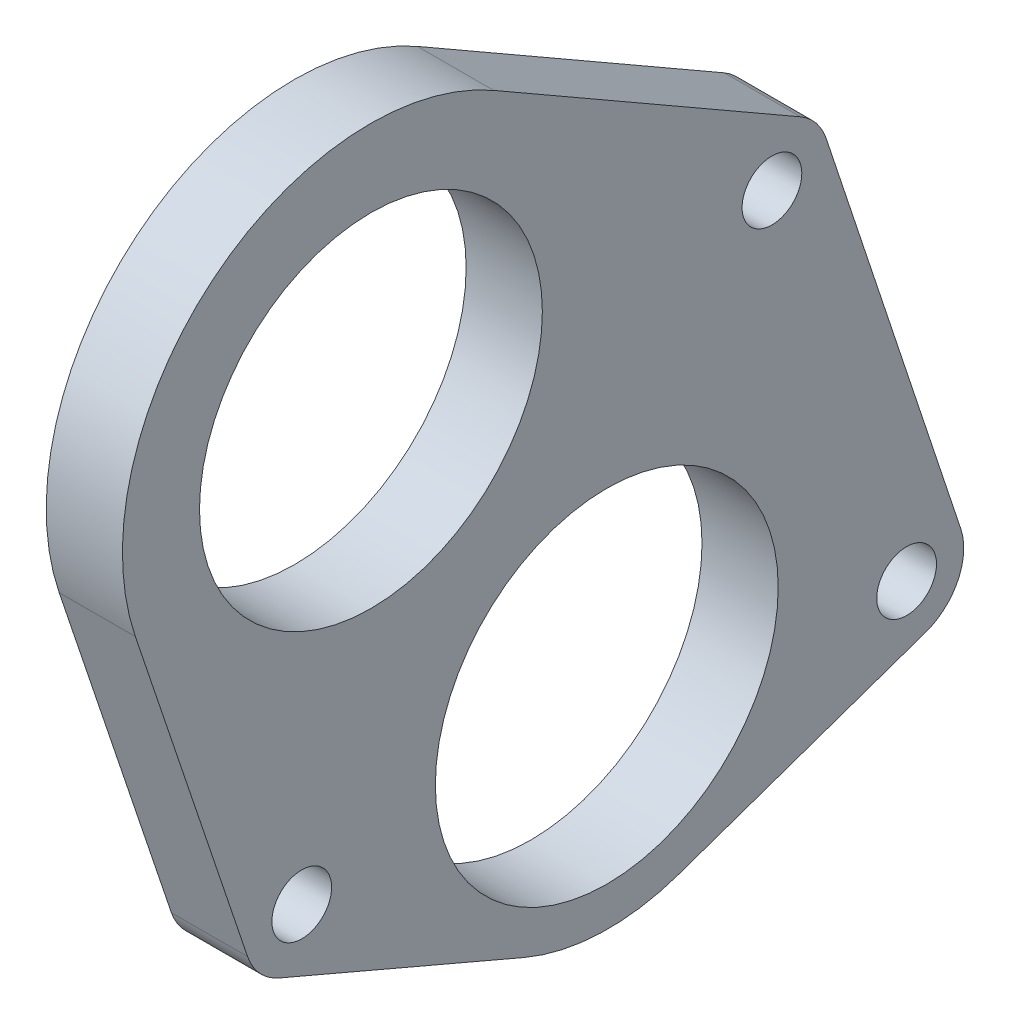
ISO-10303-21;
HEADER;
FILE_DESCRIPTION(('STEP AP214'),'2;1');
FILE_NAME('part.step','',(''),(''),'','','');
FILE_SCHEMA(('AUTOMOTIVE_DESIGN { 1 0 10303 214 1 1 1 1 }'));
ENDSEC;
DATA;
#1=APPLICATION_CONTEXT('core data for automotive mechanical design processes');
#2=APPLICATION_PROTOCOL_DEFINITION('international standard','automotive_design',2000,#1);
#3=PRODUCT_CONTEXT('',#1,'mechanical');
#4=PRODUCT('Part','Part','',(#3));
#5=PRODUCT_RELATED_PRODUCT_CATEGORY('part','',(#4));
#6=PRODUCT_DEFINITION_FORMATION('','',#4);
#7=PRODUCT_DEFINITION_CONTEXT('part definition',#1,'design');
#8=PRODUCT_DEFINITION('design','',#6,#7);
#9=PRODUCT_DEFINITION_SHAPE('','',#8);
#10=(LENGTH_UNIT() NAMED_UNIT(*) SI_UNIT(.MILLI.,.METRE.));
#11=(NAMED_UNIT(*) PLANE_ANGLE_UNIT() SI_UNIT($,.RADIAN.));
#12=(NAMED_UNIT(*) SI_UNIT($,.STERADIAN.) SOLID_ANGLE_UNIT());
#13=UNCERTAINTY_MEASURE_WITH_UNIT(LENGTH_MEASURE(1.E-05),#10,'distance_accuracy_value','');
#14=(GEOMETRIC_REPRESENTATION_CONTEXT(3) GLOBAL_UNCERTAINTY_ASSIGNED_CONTEXT((#13)) GLOBAL_UNIT_ASSIGNED_CONTEXT((#10,
#11,#12)) REPRESENTATION_CONTEXT('',''));
#15=CARTESIAN_POINT('',(0.,0.,0.));
#16=DIRECTION('',(0.,0.,1.));
#17=DIRECTION('',(1.,0.,0.));
#18=AXIS2_PLACEMENT_3D('',#15,#16,#17);
#19=CARTESIAN_POINT('',(53.975,-998.062427584568,1126.71568307028));
#20=DIRECTION('',(0.,0.319112747923367,-0.94771675837921));
#21=DIRECTION('',(0.,0.94771675837921,0.319112747923367));
#22=AXIS2_PLACEMENT_3D('',#19,#20,#21);
#23=PLANE('',#22);
#24=DIRECTION('',(0.,0.94771675837921,0.319112747923367));
#25=VECTOR('',#24,1.);
#26=CARTESIAN_POINT('',(60.325,-998.062427584568,1126.71568307028));
#27=LINE('',#26,#25);
#28=CARTESIAN_POINT('',(60.325,-1011.9503581371,1122.03937483536));
#29=VERTEX_POINT('',#28);
#30=CARTESIAN_POINT('',(60.325,-984.174497032036,1131.39199130521));
#31=VERTEX_POINT('',#30);
#32=EDGE_CURVE('E155',#29,#31,#27,.T.);
#33=ORIENTED_EDGE('',*,*,#32,.T.);
#34=DIRECTION('',(1.,0.,0.));
#35=VECTOR('',#34,1.);
#36=CARTESIAN_POINT('',(53.975,-984.174497032036,1131.39199130521));
#37=LINE('',#36,#35);
#38=CARTESIAN_POINT('',(53.975,-984.174497032036,1131.39199130521));
#39=VERTEX_POINT('',#38);
#40=EDGE_CURVE('E53',#39,#31,#37,.T.);
#41=ORIENTED_EDGE('',*,*,#40,.F.);
#42=DIRECTION('',(0.,0.94771675837921,0.319112747923367));
#43=VECTOR('',#42,1.);
#44=CARTESIAN_POINT('',(53.975,-998.062427584568,1126.71568307028));
#45=LINE('',#44,#43);
#46=CARTESIAN_POINT('',(53.975,-1011.9503581371,1122.03937483536));
#47=VERTEX_POINT('',#46);
#48=EDGE_CURVE('E190',#47,#39,#45,.T.);
#49=ORIENTED_EDGE('',*,*,#48,.F.);
#50=DIRECTION('',(1.,0.,0.));
#51=VECTOR('',#50,1.);
#52=CARTESIAN_POINT('',(53.975,-1011.9503581371,1122.03937483536));
#53=LINE('',#52,#51);
#54=EDGE_CURVE('E11',#47,#29,#53,.T.);
#55=ORIENTED_EDGE('',*,*,#54,.T.);
#56=EDGE_LOOP('',(#33,#41,#49,#55));
#57=FACE_BOUND('',#56,.T.);
#58=ADVANCED_FACE('F37',(#57),#23,.F.);
#59=CARTESIAN_POINT('',(53.975,-1010.43058367512,1117.52587377358));
#60=DIRECTION('',(1.,0.,0.));
#61=DIRECTION('',(0.,0.,-1.));
#62=AXIS2_PLACEMENT_3D('',#59,#60,#61);
#63=CYLINDRICAL_SURFACE('',#62,4.76249999999955);
#64=CARTESIAN_POINT('',(60.325,-1010.43058367512,1117.52587377358));
#65=DIRECTION('',(1.,0.,0.));
#66=DIRECTION('',(0.,0.,-1.));
#67=AXIS2_PLACEMENT_3D('',#64,#65,#66);
#68=CIRCLE('',#67,4.76249999999955);
#69=CARTESIAN_POINT('',(60.325,-1014.80960402515,1119.39819506652));
#70=VERTEX_POINT('',#69);
#71=EDGE_CURVE('E157',#29,#70,#68,.T.);
#72=ORIENTED_EDGE('',*,*,#71,.F.);
#73=ORIENTED_EDGE('',*,*,#54,.F.);
#74=CARTESIAN_POINT('',(53.975,-1010.43058367512,1117.52587377358));
#75=DIRECTION('',(1.,0.,0.));
#76=DIRECTION('',(0.,0.,-1.));
#77=AXIS2_PLACEMENT_3D('',#74,#75,#76);
#78=CIRCLE('',#77,4.76249999999955);
#79=CARTESIAN_POINT('',(53.975,-1014.80960402515,1119.39819506652));
#80=VERTEX_POINT('',#79);
#81=EDGE_CURVE('E204',#47,#80,#78,.T.);
#82=ORIENTED_EDGE('',*,*,#81,.T.);
#83=DIRECTION('',(1.,0.,0.));
#84=VECTOR('',#83,1.);
#85=CARTESIAN_POINT('',(53.975,-1014.80960402515,1119.39819506652));
#86=LINE('',#85,#84);
#87=EDGE_CURVE('E45',#80,#70,#86,.T.);
#88=ORIENTED_EDGE('',*,*,#87,.T.);
#89=EDGE_LOOP('',(#72,#73,#82,#88));
#90=FACE_BOUND('',#89,.T.);
#91=ADVANCED_FACE('F202',(#90),#63,.T.);
#92=CARTESIAN_POINT('',(53.975,-1019.17228674137,1109.19467045404));
#93=DIRECTION('',(0.,-0.919479338589026,0.393138329227624));
#94=DIRECTION('',(0.,-0.393138329227624,-0.919479338589026));
#95=AXIS2_PLACEMENT_3D('',#92,#93,#94);
#96=PLANE('',#95);
#97=DIRECTION('',(0.,-0.393138329227624,-0.919479338589026));
#98=VECTOR('',#97,1.);
#99=CARTESIAN_POINT('',(60.325,-1019.17228674137,1109.19467045404));
#100=LINE('',#99,#98);
#101=CARTESIAN_POINT('',(60.325,-1023.53496945759,1098.99114584155));
#102=VERTEX_POINT('',#101);
#103=EDGE_CURVE('E161',#70,#102,#100,.T.);
#104=ORIENTED_EDGE('',*,*,#103,.F.);
#105=ORIENTED_EDGE('',*,*,#87,.F.);
#106=DIRECTION('',(0.,-0.393138329227624,-0.919479338589026));
#107=VECTOR('',#106,1.);
#108=CARTESIAN_POINT('',(53.975,-1019.17228674137,1109.19467045404));
#109=LINE('',#108,#107);
#110=CARTESIAN_POINT('',(53.975,-1023.53496945759,1098.99114584155));
#111=VERTEX_POINT('',#110);
#112=EDGE_CURVE('E214',#80,#111,#109,.T.);
#113=ORIENTED_EDGE('',*,*,#112,.T.);
#114=DIRECTION('',(1.,0.,0.));
#115=VECTOR('',#114,1.);
#116=CARTESIAN_POINT('',(53.975,-1023.53496945759,1098.99114584155));
#117=LINE('',#116,#115);
#118=EDGE_CURVE('E200',#111,#102,#117,.T.);
#119=ORIENTED_EDGE('',*,*,#118,.T.);
#120=EDGE_LOOP('',(#104,#105,#113,#119));
#121=FACE_BOUND('',#120,.T.);
#122=ADVANCED_FACE('F208',(#121),#96,.T.);
#123=CARTESIAN_POINT('',(53.975,-1007.16327204228,1091.99116063432));
#124=DIRECTION('',(1.,0.,0.));
#125=DIRECTION('',(0.,0.,-1.));
#126=AXIS2_PLACEMENT_3D('',#123,#124,#125);
#127=CYLINDRICAL_SURFACE('',#126,17.8053999999982);
#128=CARTESIAN_POINT('',(60.325,-1007.16327204228,1091.99116063432));
#129=DIRECTION('',(1.,0.,0.));
#130=DIRECTION('',(0.,0.,-1.));
#131=AXIS2_PLACEMENT_3D('',#128,#129,#130);
#132=CIRCLE('',#131,17.8053999999982);
#133=CARTESIAN_POINT('',(60.325,-1023.97594302627,1086.12887750027));
#134=VERTEX_POINT('',#133);
#135=EDGE_CURVE('E164',#102,#134,#132,.T.);
#136=ORIENTED_EDGE('',*,*,#135,.F.);
#137=ORIENTED_EDGE('',*,*,#118,.F.);
#138=CARTESIAN_POINT('',(53.975,-1007.16327204228,1091.99116063432));
#139=DIRECTION('',(1.,0.,0.));
#140=DIRECTION('',(0.,0.,-1.));
#141=AXIS2_PLACEMENT_3D('',#138,#139,#140);
#142=CIRCLE('',#141,17.8053999999982);
#143=CARTESIAN_POINT('',(53.975,-1023.97594302627,1086.12887750027));
#144=VERTEX_POINT('',#143);
#145=EDGE_CURVE('E221',#111,#144,#142,.T.);
#146=ORIENTED_EDGE('',*,*,#145,.T.);
#147=DIRECTION('',(1.,0.,0.));
#148=VECTOR('',#147,1.);
#149=CARTESIAN_POINT('',(53.975,-1023.97594302627,1086.12887750027));
#150=LINE('',#149,#148);
#151=EDGE_CURVE('E198',#144,#134,#150,.T.);
#152=ORIENTED_EDGE('',*,*,#151,.T.);
#153=EDGE_LOOP('',(#136,#137,#146,#152));
#154=FACE_BOUND('',#153,.T.);
#155=ADVANCED_FACE('F242',(#154),#127,.T.);
#156=CARTESIAN_POINT('',(53.975,-1020.38795147858,1075.8387362694));
#157=DIRECTION('',(0.,-0.944245621215962,-0.329241866740065));
#158=DIRECTION('',(0.,0.329241866740065,-0.944245621215962));
#159=AXIS2_PLACEMENT_3D('',#156,#157,#158);
#160=PLANE('',#159);
#161=DIRECTION('',(0.,0.329241866740065,-0.944245621215962));
#162=VECTOR('',#161,1.);
#163=CARTESIAN_POINT('',(60.325,-1020.38795147858,1075.8387362694));
#164=LINE('',#163,#162);
#165=CARTESIAN_POINT('',(60.325,-1016.79995993089,1065.54859503854));
#166=VERTEX_POINT('',#165);
#167=EDGE_CURVE('E167',#134,#166,#164,.T.);
#168=ORIENTED_EDGE('',*,*,#167,.F.);
#169=ORIENTED_EDGE('',*,*,#151,.F.);
#170=DIRECTION('',(0.,0.329241866740065,-0.944245621215962));
#171=VECTOR('',#170,1.);
#172=CARTESIAN_POINT('',(53.975,-1020.38795147858,1075.8387362694));
#173=LINE('',#172,#171);
#174=CARTESIAN_POINT('',(53.975,-1016.79995993089,1065.54859503854));
#175=VERTEX_POINT('',#174);
#176=EDGE_CURVE('E224',#144,#175,#173,.T.);
#177=ORIENTED_EDGE('',*,*,#176,.T.);
#178=DIRECTION('',(1.,0.,0.));
#179=VECTOR('',#178,1.);
#180=CARTESIAN_POINT('',(53.975,-1016.79995993089,1065.54859503854));
#181=LINE('',#180,#179);
#182=EDGE_CURVE('E196',#175,#166,#181,.T.);
#183=ORIENTED_EDGE('',*,*,#182,.T.);
#184=EDGE_LOOP('',(#168,#169,#177,#183));
#185=FACE_BOUND('',#184,.T.);
#186=ADVANCED_FACE('F239',(#185),#160,.T.);
#187=CARTESIAN_POINT('',(53.975,-1012.30299015985,1067.11660942889));
#188=DIRECTION('',(1.,0.,0.));
#189=DIRECTION('',(0.,0.,-1.));
#190=AXIS2_PLACEMENT_3D('',#187,#188,#189);
#191=CYLINDRICAL_SURFACE('',#190,4.7624999999997);
#192=CARTESIAN_POINT('',(60.325,-1012.30299015985,1067.11660942889));
#193=DIRECTION('',(-1.,0.,0.));
#194=DIRECTION('',(0.,0.,-1.));
#195=AXIS2_PLACEMENT_3D('',#192,#193,#194);
#196=CIRCLE('',#195,4.7624999999997);
#197=CARTESIAN_POINT('',(60.325,-1010.802258706,1062.59674091825));
#198=VERTEX_POINT('',#197);
#199=EDGE_CURVE('E170',#198,#166,#196,.T.);
#200=ORIENTED_EDGE('',*,*,#199,.T.);
#201=ORIENTED_EDGE('',*,*,#182,.F.);
#202=CARTESIAN_POINT('',(53.975,-1012.30299015985,1067.11660942889));
#203=DIRECTION('',(-1.,0.,0.));
#204=DIRECTION('',(0.,0.,-1.));
#205=AXIS2_PLACEMENT_3D('',#202,#203,#204);
#206=CIRCLE('',#205,4.7624999999997);
#207=CARTESIAN_POINT('',(53.975,-1010.802258706,1062.59674091825));
#208=VERTEX_POINT('',#207);
#209=EDGE_CURVE('E227',#208,#175,#206,.T.);
#210=ORIENTED_EDGE('',*,*,#209,.F.);
#211=DIRECTION('',(1.,0.,0.));
#212=VECTOR('',#211,1.);
#213=CARTESIAN_POINT('',(53.975,-1010.802258706,1062.59674091825));
#214=LINE('',#213,#212);
#215=EDGE_CURVE('E194',#208,#198,#214,.T.);
#216=ORIENTED_EDGE('',*,*,#215,.T.);
#217=EDGE_LOOP('',(#200,#201,#210,#216));
#218=FACE_BOUND('',#217,.T.);
#219=ADVANCED_FACE('F236',(#218),#191,.T.);
#220=CARTESIAN_POINT('',(53.975,-993.899407000879,1068.20899294591));
#221=DIRECTION('',(0.,-0.31511421603077,0.949053755514045));
#222=DIRECTION('',(0.,-0.949053755514045,-0.31511421603077));
#223=AXIS2_PLACEMENT_3D('',#220,#221,#222);
#224=PLANE('',#223);
#225=DIRECTION('',(0.,-0.949053755514045,-0.31511421603077));
#226=VECTOR('',#225,1.);
#227=CARTESIAN_POINT('',(60.325,-993.899407000879,1068.20899294591));
#228=LINE('',#227,#226);
#229=CARTESIAN_POINT('',(60.325,-976.996555295757,1073.82124497357));
#230=VERTEX_POINT('',#229);
#231=EDGE_CURVE('E173',#230,#198,#228,.T.);
#232=ORIENTED_EDGE('',*,*,#231,.T.);
#233=ORIENTED_EDGE('',*,*,#215,.F.);
#234=DIRECTION('',(0.,-0.949053755514045,-0.31511421603077));
#235=VECTOR('',#234,1.);
#236=CARTESIAN_POINT('',(53.975,-993.899407000879,1068.20899294591));
#237=LINE('',#236,#235);
#238=CARTESIAN_POINT('',(53.975,-976.996555295757,1073.82124497357));
#239=VERTEX_POINT('',#238);
#240=EDGE_CURVE('E136',#239,#208,#237,.T.);
#241=ORIENTED_EDGE('',*,*,#240,.F.);
#242=DIRECTION('',(1.,0.,0.));
#243=VECTOR('',#242,1.);
#244=CARTESIAN_POINT('',(53.975,-976.996555295757,1073.82124497357));
#245=LINE('',#244,#243);
#246=EDGE_CURVE('E128',#239,#230,#245,.T.);
#247=ORIENTED_EDGE('',*,*,#246,.T.);
#248=EDGE_LOOP('',(#232,#233,#241,#247));
#249=FACE_BOUND('',#248,.T.);
#250=ADVANCED_FACE('F232',(#249),#224,.F.);
#251=CARTESIAN_POINT('',(53.975,-978.497286749604,1078.34111348421));
#252=DIRECTION('',(1.,0.,0.));
#253=DIRECTION('',(0.,0.,-1.));
#254=AXIS2_PLACEMENT_3D('',#251,#252,#253);
#255=CYLINDRICAL_SURFACE('',#254,4.76250000000076);
#256=CARTESIAN_POINT('',(60.325,-978.497286749604,1078.34111348421));
#257=DIRECTION('',(-1.,0.,0.));
#258=DIRECTION('',(0.,0.,-1.));
#259=AXIS2_PLACEMENT_3D('',#256,#257,#258);
#260=CIRCLE('',#259,4.76250000000076);
#261=CARTESIAN_POINT('',(60.325,-974.367824252587,1075.96857355078));
#262=VERTEX_POINT('',#261);
#263=EDGE_CURVE('E176',#262,#230,#260,.T.);
#264=ORIENTED_EDGE('',*,*,#263,.T.);
#265=ORIENTED_EDGE('',*,*,#246,.F.);
#266=CARTESIAN_POINT('',(53.975,-978.497286749604,1078.34111348421));
#267=DIRECTION('',(-1.,0.,0.));
#268=DIRECTION('',(0.,0.,-1.));
#269=AXIS2_PLACEMENT_3D('',#266,#267,#268);
#270=CIRCLE('',#269,4.76250000000076);
#271=CARTESIAN_POINT('',(53.975,-974.367824252587,1075.96857355078));
#272=VERTEX_POINT('',#271);
#273=EDGE_CURVE('E131',#272,#239,#270,.T.);
#274=ORIENTED_EDGE('',*,*,#273,.F.);
#275=DIRECTION('',(1.,0.,0.));
#276=VECTOR('',#275,1.);
#277=CARTESIAN_POINT('',(53.975,-974.367824252587,1075.96857355078));
#278=LINE('',#277,#276);
#279=EDGE_CURVE('E117',#272,#262,#278,.T.);
#280=ORIENTED_EDGE('',*,*,#279,.T.);
#281=EDGE_LOOP('',(#264,#265,#274,#280));
#282=FACE_BOUND('',#281,.T.);
#283=ADVANCED_FACE('F132',(#282),#255,.T.);
#284=CARTESIAN_POINT('',(53.975,-967.023614915196,1088.75134555037));
#285=DIRECTION('',(0.,-0.867078739531099,0.498171114631469));
#286=DIRECTION('',(0.,-0.49817111463147,-0.867078739531099));
#287=AXIS2_PLACEMENT_3D('',#284,#285,#286);
#288=PLANE('',#287);
#289=DIRECTION('',(0.,-0.49817111463147,-0.867078739531099));
#290=VECTOR('',#289,1.);
#291=CARTESIAN_POINT('',(60.325,-967.023614915196,1088.75134555037));
#292=LINE('',#291,#290);
#293=CARTESIAN_POINT('',(60.325,-959.679405577804,1101.53411754997));
#294=VERTEX_POINT('',#293);
#295=EDGE_CURVE('E124',#294,#262,#292,.T.);
#296=ORIENTED_EDGE('',*,*,#295,.T.);
#297=ORIENTED_EDGE('',*,*,#279,.F.);
#298=DIRECTION('',(0.,-0.49817111463147,-0.867078739531099));
#299=VECTOR('',#298,1.);
#300=CARTESIAN_POINT('',(53.975,-967.023614915196,1088.75134555037));
#301=LINE('',#300,#299);
#302=CARTESIAN_POINT('',(53.975,-959.679405577804,1101.53411754997));
#303=VERTEX_POINT('',#302);
#304=EDGE_CURVE('E121',#303,#272,#301,.T.);
#305=ORIENTED_EDGE('',*,*,#304,.F.);
#306=DIRECTION('',(1.,0.,0.));
#307=VECTOR('',#306,1.);
#308=CARTESIAN_POINT('',(53.975,-959.679405577804,1101.53411754997));
#309=LINE('',#308,#307);
#310=EDGE_CURVE('E87',#303,#294,#309,.T.);
#311=ORIENTED_EDGE('',*,*,#310,.T.);
#312=EDGE_LOOP('',(#296,#297,#305,#311));
#313=FACE_BOUND('',#312,.T.);
#314=ADVANCED_FACE('F119',(#313),#288,.F.);
#315=CARTESIAN_POINT('',(53.975,-1012.30299015985,1067.11660942889));
#316=DIRECTION('',(1.,0.,0.));
#317=DIRECTION('',(0.,0.,-1.));
#318=AXIS2_PLACEMENT_3D('',#315,#316,#317);
#319=CYLINDRICAL_SURFACE('',#318,2.48920000000008);
#320=CARTESIAN_POINT('',(53.975,-1012.30299015985,1067.11660942889));
#321=DIRECTION('',(1.,0.,0.));
#322=DIRECTION('',(0.,0.,-1.));
#323=AXIS2_PLACEMENT_3D('',#320,#321,#322);
#324=CIRCLE('',#323,2.48920000000008);
#325=CARTESIAN_POINT('',(53.975,-1012.30299015985,1064.62740942889));
#326=VERTEX_POINT('',#325);
#327=EDGE_CURVE('E152',#326,#326,#324,.T.);
#328=ORIENTED_EDGE('',*,*,#327,.F.);
#329=EDGE_LOOP('',(#328));
#330=FACE_BOUND('',#329,.T.);
#331=CARTESIAN_POINT('',(60.325,-1012.30299015985,1067.11660942889));
#332=DIRECTION('',(1.,0.,0.));
#333=DIRECTION('',(0.,0.,-1.));
#334=AXIS2_PLACEMENT_3D('',#331,#332,#333);
#335=CIRCLE('',#334,2.48920000000008);
#336=CARTESIAN_POINT('',(60.325,-1012.30299015985,1064.62740942889));
#337=VERTEX_POINT('',#336);
#338=EDGE_CURVE('E187',#337,#337,#335,.T.);
#339=ORIENTED_EDGE('',*,*,#338,.T.);
#340=EDGE_LOOP('',(#339));
#341=FACE_BOUND('',#340,.T.);
#342=ADVANCED_FACE('F301',(#330,#341),#319,.F.);
#343=CARTESIAN_POINT('',(53.975,-1010.43058367511,1117.52587377358));
#344=DIRECTION('',(1.,0.,0.));
#345=DIRECTION('',(0.,0.,-1.));
#346=AXIS2_PLACEMENT_3D('',#343,#344,#345);
#347=CYLINDRICAL_SURFACE('',#346,2.48920000000008);
#348=CARTESIAN_POINT('',(53.975,-1010.43058367511,1117.52587377358));
#349=DIRECTION('',(1.,0.,0.));
#350=DIRECTION('',(0.,0.,-1.));
#351=AXIS2_PLACEMENT_3D('',#348,#349,#350);
#352=CIRCLE('',#351,2.48920000000008);
#353=CARTESIAN_POINT('',(53.975,-1010.43058367511,1115.03667377358));
#354=VERTEX_POINT('',#353);
#355=EDGE_CURVE('E149',#354,#354,#352,.T.);
#356=ORIENTED_EDGE('',*,*,#355,.F.);
#357=EDGE_LOOP('',(#356));
#358=FACE_BOUND('',#357,.T.);
#359=CARTESIAN_POINT('',(60.325,-1010.43058367511,1117.52587377358));
#360=DIRECTION('',(1.,0.,0.));
#361=DIRECTION('',(0.,0.,-1.));
#362=AXIS2_PLACEMENT_3D('',#359,#360,#361);
#363=CIRCLE('',#362,2.48920000000008);
#364=CARTESIAN_POINT('',(60.325,-1010.43058367511,1115.03667377358));
#365=VERTEX_POINT('',#364);
#366=EDGE_CURVE('E184',#365,#365,#363,.T.);
#367=ORIENTED_EDGE('',*,*,#366,.T.);
#368=EDGE_LOOP('',(#367));
#369=FACE_BOUND('',#368,.T.);
#370=ADVANCED_FACE('F309',(#358,#369),#347,.F.);
#371=CARTESIAN_POINT('',(53.975,-978.497286749611,1078.34111348422));
#372=DIRECTION('',(1.,0.,0.));
#373=DIRECTION('',(0.,0.,-1.));
#374=AXIS2_PLACEMENT_3D('',#371,#372,#373);
#375=CYLINDRICAL_SURFACE('',#374,2.48920000000008);
#376=CARTESIAN_POINT('',(53.975,-978.497286749611,1078.34111348422));
#377=DIRECTION('',(1.,0.,0.));
#378=DIRECTION('',(0.,0.,-1.));
#379=AXIS2_PLACEMENT_3D('',#376,#377,#378);
#380=CIRCLE('',#379,2.48920000000008);
#381=CARTESIAN_POINT('',(53.975,-978.497286749611,1075.85191348422));
#382=VERTEX_POINT('',#381);
#383=EDGE_CURVE('E143',#382,#382,#380,.T.);
#384=ORIENTED_EDGE('',*,*,#383,.F.);
#385=EDGE_LOOP('',(#384));
#386=FACE_BOUND('',#385,.T.);
#387=CARTESIAN_POINT('',(60.325,-978.497286749611,1078.34111348422));
#388=DIRECTION('',(1.,0.,0.));
#389=DIRECTION('',(0.,0.,-1.));
#390=AXIS2_PLACEMENT_3D('',#387,#388,#389);
#391=CIRCLE('',#390,2.48920000000008);
#392=CARTESIAN_POINT('',(60.325,-978.497286749611,1075.85191348422));
#393=VERTEX_POINT('',#392);
#394=EDGE_CURVE('E181',#393,#393,#391,.T.);
#395=ORIENTED_EDGE('',*,*,#394,.T.);
#396=EDGE_LOOP('',(#395));
#397=FACE_BOUND('',#396,.T.);
#398=ADVANCED_FACE('F318',(#386,#397),#375,.F.);
#399=CARTESIAN_POINT('',(53.975,-977.584754964869,1111.82145070133));
#400=DIRECTION('',(1.,0.,0.));
#401=DIRECTION('',(0.,0.,-1.));
#402=AXIS2_PLACEMENT_3D('',#399,#400,#401);
#403=CYLINDRICAL_SURFACE('',#402,20.6502);
#404=CARTESIAN_POINT('',(60.325,-977.584754964869,1111.82145070133));
#405=DIRECTION('',(-1.,0.,0.));
#406=DIRECTION('',(0.,0.,-1.));
#407=AXIS2_PLACEMENT_3D('',#404,#405,#406);
#408=CIRCLE('',#407,20.6502);
#409=EDGE_CURVE('E179',#31,#294,#408,.T.);
#410=ORIENTED_EDGE('',*,*,#409,.T.);
#411=ORIENTED_EDGE('',*,*,#310,.F.);
#412=CARTESIAN_POINT('',(53.975,-977.584754964869,1111.82145070133));
#413=DIRECTION('',(-1.,0.,0.));
#414=DIRECTION('',(0.,0.,-1.));
#415=AXIS2_PLACEMENT_3D('',#412,#413,#414);
#416=CIRCLE('',#415,20.6502);
#417=EDGE_CURVE('E141',#39,#303,#416,.T.);
#418=ORIENTED_EDGE('',*,*,#417,.F.);
#419=ORIENTED_EDGE('',*,*,#40,.T.);
#420=EDGE_LOOP('',(#410,#411,#418,#419));
#421=FACE_BOUND('',#420,.T.);
#422=ADVANCED_FACE('F327',(#421),#403,.T.);
#423=CARTESIAN_POINT('',(53.975,-990.951613503573,1097.41288006511));
#424=DIRECTION('',(1.,0.,0.));
#425=DIRECTION('',(0.,1.,0.));
#426=AXIS2_PLACEMENT_3D('',#423,#424,#425);
#427=PLANE('',#426);
#428=CARTESIAN_POINT('',(53.975,-1007.40019203727,1092.10461131208));
#429=DIRECTION('',(1.,0.,0.));
#430=DIRECTION('',(0.,0.,-1.));
#431=AXIS2_PLACEMENT_3D('',#428,#429,#430);
#432=CIRCLE('',#431,14.2874999999999);
#433=CARTESIAN_POINT('',(53.975,-1007.40019203727,1077.81711131208));
#434=VERTEX_POINT('',#433);
#435=EDGE_CURVE('E158',#434,#434,#432,.T.);
#436=ORIENTED_EDGE('',*,*,#435,.T.);
#437=EDGE_LOOP('',(#436));
#438=FACE_BOUND('',#437,.T.);
#439=CARTESIAN_POINT('',(53.975,-977.675611566997,1111.76136756295));
#440=DIRECTION('',(1.,0.,0.));
#441=DIRECTION('',(0.,0.,-1.));
#442=AXIS2_PLACEMENT_3D('',#439,#440,#441);
#443=CIRCLE('',#442,14.2874999999999);
#444=CARTESIAN_POINT('',(53.975,-977.675611566997,1097.47386756295));
#445=VERTEX_POINT('',#444);
#446=EDGE_CURVE('E385',#445,#445,#443,.T.);
#447=ORIENTED_EDGE('',*,*,#446,.T.);
#448=EDGE_LOOP('',(#447));
#449=FACE_BOUND('',#448,.T.);
#450=ORIENTED_EDGE('',*,*,#48,.T.);
#451=ORIENTED_EDGE('',*,*,#417,.T.);
#452=ORIENTED_EDGE('',*,*,#304,.T.);
#453=ORIENTED_EDGE('',*,*,#273,.T.);
#454=ORIENTED_EDGE('',*,*,#240,.T.);
#455=ORIENTED_EDGE('',*,*,#209,.T.);
#456=ORIENTED_EDGE('',*,*,#176,.F.);
#457=ORIENTED_EDGE('',*,*,#145,.F.);
#458=ORIENTED_EDGE('',*,*,#112,.F.);
#459=ORIENTED_EDGE('',*,*,#81,.F.);
#460=EDGE_LOOP('',(#450,#451,#452,#453,#454,#455,#456,#457,#458,#459));
#461=FACE_BOUND('',#460,.T.);
#462=ORIENTED_EDGE('',*,*,#383,.T.);
#463=EDGE_LOOP('',(#462));
#464=FACE_BOUND('',#463,.T.);
#465=ORIENTED_EDGE('',*,*,#355,.T.);
#466=EDGE_LOOP('',(#465));
#467=FACE_BOUND('',#466,.T.);
#468=ORIENTED_EDGE('',*,*,#327,.T.);
#469=EDGE_LOOP('',(#468));
#470=FACE_BOUND('',#469,.T.);
#471=ADVANCED_FACE('F139',(#438,#449,#461,#464,#467,#470),#427,.F.);
#472=CARTESIAN_POINT('',(60.325,-990.951613503573,1097.41288006511));
#473=DIRECTION('',(1.,0.,0.));
#474=DIRECTION('',(0.,1.,0.));
#475=AXIS2_PLACEMENT_3D('',#472,#473,#474);
#476=PLANE('',#475);
#477=CARTESIAN_POINT('',(60.325,-1007.40019203727,1092.10461131208));
#478=DIRECTION('',(1.,0.,0.));
#479=DIRECTION('',(0.,0.,-1.));
#480=AXIS2_PLACEMENT_3D('',#477,#478,#479);
#481=CIRCLE('',#480,14.2874999999999);
#482=CARTESIAN_POINT('',(60.325,-1007.40019203727,1077.81711131208));
#483=VERTEX_POINT('',#482);
#484=EDGE_CURVE('E384',#483,#483,#481,.T.);
#485=ORIENTED_EDGE('',*,*,#484,.F.);
#486=EDGE_LOOP('',(#485));
#487=FACE_BOUND('',#486,.T.);
#488=CARTESIAN_POINT('',(60.325,-977.675611566997,1111.76136756295));
#489=DIRECTION('',(1.,0.,0.));
#490=DIRECTION('',(0.,0.,-1.));
#491=AXIS2_PLACEMENT_3D('',#488,#489,#490);
#492=CIRCLE('',#491,14.2874999999999);
#493=CARTESIAN_POINT('',(60.325,-977.675611566997,1097.47386756295));
#494=VERTEX_POINT('',#493);
#495=EDGE_CURVE('E217',#494,#494,#492,.T.);
#496=ORIENTED_EDGE('',*,*,#495,.F.);
#497=EDGE_LOOP('',(#496));
#498=FACE_BOUND('',#497,.T.);
#499=ORIENTED_EDGE('',*,*,#32,.F.);
#500=ORIENTED_EDGE('',*,*,#71,.T.);
#501=ORIENTED_EDGE('',*,*,#103,.T.);
#502=ORIENTED_EDGE('',*,*,#135,.T.);
#503=ORIENTED_EDGE('',*,*,#167,.T.);
#504=ORIENTED_EDGE('',*,*,#199,.F.);
#505=ORIENTED_EDGE('',*,*,#231,.F.);
#506=ORIENTED_EDGE('',*,*,#263,.F.);
#507=ORIENTED_EDGE('',*,*,#295,.F.);
#508=ORIENTED_EDGE('',*,*,#409,.F.);
#509=EDGE_LOOP('',(#499,#500,#501,#502,#503,#504,#505,#506,#507,#508));
#510=FACE_BOUND('',#509,.T.);
#511=ORIENTED_EDGE('',*,*,#394,.F.);
#512=EDGE_LOOP('',(#511));
#513=FACE_BOUND('',#512,.T.);
#514=ORIENTED_EDGE('',*,*,#366,.F.);
#515=EDGE_LOOP('',(#514));
#516=FACE_BOUND('',#515,.T.);
#517=ORIENTED_EDGE('',*,*,#338,.F.);
#518=EDGE_LOOP('',(#517));
#519=FACE_BOUND('',#518,.T.);
#520=ADVANCED_FACE('F211',(#487,#498,#510,#513,#516,#519),#476,.T.);
#521=CARTESIAN_POINT('',(53.975,-977.675611566997,1111.76136756295));
#522=DIRECTION('',(1.,0.,0.));
#523=DIRECTION('',(0.,0.,-1.));
#524=AXIS2_PLACEMENT_3D('',#521,#522,#523);
#525=CYLINDRICAL_SURFACE('',#524,14.2874999999999);
#526=ORIENTED_EDGE('',*,*,#446,.F.);
#527=EDGE_LOOP('',(#526));
#528=FACE_BOUND('',#527,.T.);
#529=ORIENTED_EDGE('',*,*,#495,.T.);
#530=EDGE_LOOP('',(#529));
#531=FACE_BOUND('',#530,.T.);
#532=ADVANCED_FACE('F355',(#528,#531),#525,.F.);
#533=CARTESIAN_POINT('',(53.975,-1007.40019203727,1092.10461131208));
#534=DIRECTION('',(1.,0.,0.));
#535=DIRECTION('',(0.,0.,-1.));
#536=AXIS2_PLACEMENT_3D('',#533,#534,#535);
#537=CYLINDRICAL_SURFACE('',#536,14.2874999999999);
#538=ORIENTED_EDGE('',*,*,#435,.F.);
#539=EDGE_LOOP('',(#538));
#540=FACE_BOUND('',#539,.T.);
#541=ORIENTED_EDGE('',*,*,#484,.T.);
#542=EDGE_LOOP('',(#541));
#543=FACE_BOUND('',#542,.T.);
#544=ADVANCED_FACE('F365',(#540,#543),#537,.F.);
#545=CLOSED_SHELL('',(#58,#91,#122,#155,#186,#219,#250,#283,#314,#342,#370,#398,#422,#471,#520,
#532,#544));
#546=MANIFOLD_SOLID_BREP('B2',#545);
#547=ADVANCED_BREP_SHAPE_REPRESENTATION('',(#18,#546),#14);
#548=SHAPE_DEFINITION_REPRESENTATION(#9,#547);
ENDSEC;
END-ISO-10303-21;
